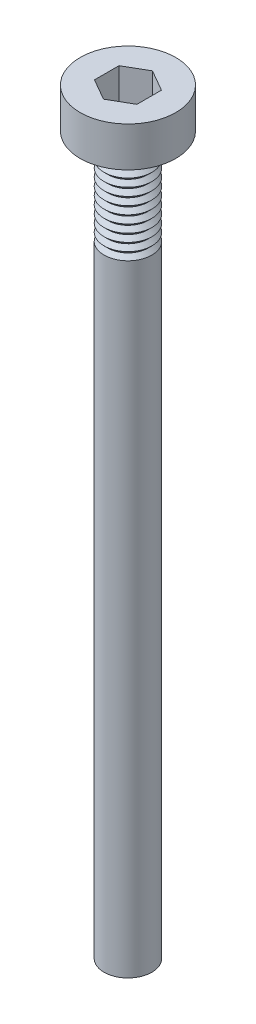
ISO-10303-21;
HEADER;
FILE_DESCRIPTION(('STEP AP214'),'2;1');
FILE_NAME('part.step','',(''),(''),'','','');
FILE_SCHEMA(('AUTOMOTIVE_DESIGN { 1 0 10303 214 1 1 1 1 }'));
ENDSEC;
DATA;
#1=APPLICATION_CONTEXT('core data for automotive mechanical design processes');
#2=APPLICATION_PROTOCOL_DEFINITION('international standard','automotive_design',2000,#1);
#3=PRODUCT_CONTEXT('',#1,'mechanical');
#4=PRODUCT('Part','Part','',(#3));
#5=PRODUCT_RELATED_PRODUCT_CATEGORY('part','',(#4));
#6=PRODUCT_DEFINITION_FORMATION('','',#4);
#7=PRODUCT_DEFINITION_CONTEXT('part definition',#1,'design');
#8=PRODUCT_DEFINITION('design','',#6,#7);
#9=PRODUCT_DEFINITION_SHAPE('','',#8);
#10=(LENGTH_UNIT() NAMED_UNIT(*) SI_UNIT(.MILLI.,.METRE.));
#11=(NAMED_UNIT(*) PLANE_ANGLE_UNIT() SI_UNIT($,.RADIAN.));
#12=(NAMED_UNIT(*) SI_UNIT($,.STERADIAN.) SOLID_ANGLE_UNIT());
#13=UNCERTAINTY_MEASURE_WITH_UNIT(LENGTH_MEASURE(1.E-05),#10,'distance_accuracy_value','');
#14=(GEOMETRIC_REPRESENTATION_CONTEXT(3) GLOBAL_UNCERTAINTY_ASSIGNED_CONTEXT((#13)) GLOBAL_UNIT_ASSIGNED_CONTEXT((#10,
#11,#12)) REPRESENTATION_CONTEXT('',''));
#15=CARTESIAN_POINT('',(0.,0.,0.));
#16=DIRECTION('',(0.,0.,1.));
#17=DIRECTION('',(1.,0.,0.));
#18=AXIS2_PLACEMENT_3D('',#15,#16,#17);
#19=CARTESIAN_POINT('',(-0.666144133604045,47.5,1.15379548456616));
#20=DIRECTION('',(-0.499999999999999,0.,0.866025403784439));
#21=DIRECTION('',(0.866025403784439,0.,0.499999999999999));
#22=AXIS2_PLACEMENT_3D('',#19,#20,#21);
#23=PLANE('',#22);
#24=DIRECTION('',(0.,1.,0.));
#25=VECTOR('',#24,1.);
#26=CARTESIAN_POINT('',(-1.33228826720809,47.5,0.769196989710771));
#27=LINE('',#26,#25);
#28=CARTESIAN_POINT('',(-1.33228826720809,45.5,0.769196989710773));
#29=VERTEX_POINT('',#28);
#30=CARTESIAN_POINT('',(-1.33228826720809,47.5,0.769196989710773));
#31=VERTEX_POINT('',#30);
#32=EDGE_CURVE('E81',#29,#31,#27,.T.);
#33=ORIENTED_EDGE('',*,*,#32,.T.);
#34=DIRECTION('',(0.866025403784439,0.,0.499999999999999));
#35=VECTOR('',#34,1.);
#36=CARTESIAN_POINT('',(-0.666144133604045,47.5,1.15379548456616));
#37=LINE('',#36,#35);
#38=CARTESIAN_POINT('',(0.,47.5,1.53839397942154));
#39=VERTEX_POINT('',#38);
#40=EDGE_CURVE('E71',#39,#31,#37,.F.);
#41=ORIENTED_EDGE('',*,*,#40,.F.);
#42=DIRECTION('',(0.,1.,0.));
#43=VECTOR('',#42,1.);
#44=CARTESIAN_POINT('',(0.,47.5,1.53839397942154));
#45=LINE('',#44,#43);
#46=CARTESIAN_POINT('',(0.,45.5,1.53839397942154));
#47=VERTEX_POINT('',#46);
#48=EDGE_CURVE('E132',#39,#47,#45,.F.);
#49=ORIENTED_EDGE('',*,*,#48,.T.);
#50=DIRECTION('',(0.866025403784439,0.,0.499999999999999));
#51=VECTOR('',#50,1.);
#52=CARTESIAN_POINT('',(-0.666144133604045,45.5,1.15379548456616));
#53=LINE('',#52,#51);
#54=EDGE_CURVE('E67',#29,#47,#53,.T.);
#55=ORIENTED_EDGE('',*,*,#54,.F.);
#56=EDGE_LOOP('',(#33,#41,#49,#55));
#57=FACE_BOUND('',#56,.T.);
#58=ADVANCED_FACE('F17',(#57),#23,.F.);
#59=CARTESIAN_POINT('',(-1.33228826720809,47.5,0.));
#60=DIRECTION('',(-1.,0.,0.));
#61=DIRECTION('',(0.,0.,1.));
#62=AXIS2_PLACEMENT_3D('',#59,#60,#61);
#63=PLANE('',#62);
#64=DIRECTION('',(0.,1.,0.));
#65=VECTOR('',#64,1.);
#66=CARTESIAN_POINT('',(-1.33228826720809,47.5,-0.769196989710775));
#67=LINE('',#66,#65);
#68=CARTESIAN_POINT('',(-1.33228826720809,45.5,-0.769196989710774));
#69=VERTEX_POINT('',#68);
#70=CARTESIAN_POINT('',(-1.33228826720809,47.5,-0.769196989710774));
#71=VERTEX_POINT('',#70);
#72=EDGE_CURVE('E86',#69,#71,#67,.T.);
#73=ORIENTED_EDGE('',*,*,#72,.T.);
#74=DIRECTION('',(0.,0.,1.));
#75=VECTOR('',#74,1.);
#76=CARTESIAN_POINT('',(-1.33228826720809,47.5,0.));
#77=LINE('',#76,#75);
#78=EDGE_CURVE('E74',#31,#71,#77,.F.);
#79=ORIENTED_EDGE('',*,*,#78,.F.);
#80=ORIENTED_EDGE('',*,*,#32,.F.);
#81=DIRECTION('',(0.,0.,1.));
#82=VECTOR('',#81,1.);
#83=CARTESIAN_POINT('',(-1.33228826720809,45.5,0.));
#84=LINE('',#83,#82);
#85=EDGE_CURVE('E87',#69,#29,#84,.T.);
#86=ORIENTED_EDGE('',*,*,#85,.F.);
#87=EDGE_LOOP('',(#73,#79,#80,#86));
#88=FACE_BOUND('',#87,.T.);
#89=ADVANCED_FACE('F84',(#88),#63,.F.);
#90=CARTESIAN_POINT('',(0.666144133604045,47.5,1.15379548456616));
#91=DIRECTION('',(0.499999999999998,0.,0.86602540378444));
#92=DIRECTION('',(0.86602540378444,0.,-0.499999999999998));
#93=AXIS2_PLACEMENT_3D('',#90,#91,#92);
#94=PLANE('',#93);
#95=ORIENTED_EDGE('',*,*,#48,.F.);
#96=DIRECTION('',(0.86602540378444,0.,-0.499999999999998));
#97=VECTOR('',#96,1.);
#98=CARTESIAN_POINT('',(0.666144133604045,47.5,1.15379548456616));
#99=LINE('',#98,#97);
#100=CARTESIAN_POINT('',(1.33228826720809,47.5,0.769196989710774));
#101=VERTEX_POINT('',#100);
#102=EDGE_CURVE('E77',#101,#39,#99,.F.);
#103=ORIENTED_EDGE('',*,*,#102,.F.);
#104=DIRECTION('',(0.,1.,0.));
#105=VECTOR('',#104,1.);
#106=CARTESIAN_POINT('',(1.33228826720809,47.5,0.769196989710773));
#107=LINE('',#106,#105);
#108=CARTESIAN_POINT('',(1.33228826720809,45.5,0.769196989710774));
#109=VERTEX_POINT('',#108);
#110=EDGE_CURVE('E123',#101,#109,#107,.F.);
#111=ORIENTED_EDGE('',*,*,#110,.T.);
#112=DIRECTION('',(0.86602540378444,0.,-0.499999999999998));
#113=VECTOR('',#112,1.);
#114=CARTESIAN_POINT('',(0.666144133604045,45.5,1.15379548456616));
#115=LINE('',#114,#113);
#116=EDGE_CURVE('E130',#47,#109,#115,.T.);
#117=ORIENTED_EDGE('',*,*,#116,.F.);
#118=EDGE_LOOP('',(#95,#103,#111,#117));
#119=FACE_BOUND('',#118,.T.);
#120=ADVANCED_FACE('F135',(#119),#94,.F.);
#121=CARTESIAN_POINT('',(-0.666144133604044,47.5,-1.15379548456616));
#122=DIRECTION('',(-0.499999999999998,0.,-0.86602540378444));
#123=DIRECTION('',(-0.86602540378444,0.,0.499999999999998));
#124=AXIS2_PLACEMENT_3D('',#121,#122,#123);
#125=PLANE('',#124);
#126=DIRECTION('',(0.,1.,0.));
#127=VECTOR('',#126,1.);
#128=CARTESIAN_POINT('',(0.,47.5,-1.53839397942154));
#129=LINE('',#128,#127);
#130=CARTESIAN_POINT('',(0.,45.5,-1.53839397942154));
#131=VERTEX_POINT('',#130);
#132=CARTESIAN_POINT('',(0.,47.5,-1.53839397942154));
#133=VERTEX_POINT('',#132);
#134=EDGE_CURVE('E115',#131,#133,#129,.T.);
#135=ORIENTED_EDGE('',*,*,#134,.T.);
#136=DIRECTION('',(-0.86602540378444,0.,0.499999999999998));
#137=VECTOR('',#136,1.);
#138=CARTESIAN_POINT('',(-0.666144133604044,47.5,-1.15379548456616));
#139=LINE('',#138,#137);
#140=EDGE_CURVE('E35',#71,#133,#139,.F.);
#141=ORIENTED_EDGE('',*,*,#140,.F.);
#142=ORIENTED_EDGE('',*,*,#72,.F.);
#143=DIRECTION('',(-0.86602540378444,0.,0.499999999999998));
#144=VECTOR('',#143,1.);
#145=CARTESIAN_POINT('',(0.,45.5,-1.53839397942154));
#146=LINE('',#145,#144);
#147=EDGE_CURVE('E117',#131,#69,#146,.T.);
#148=ORIENTED_EDGE('',*,*,#147,.F.);
#149=EDGE_LOOP('',(#135,#141,#142,#148));
#150=FACE_BOUND('',#149,.T.);
#151=ADVANCED_FACE('F142',(#150),#125,.F.);
#152=CARTESIAN_POINT('',(1.33228826720809,47.5,0.));
#153=DIRECTION('',(1.,0.,0.));
#154=DIRECTION('',(0.,0.,-1.));
#155=AXIS2_PLACEMENT_3D('',#152,#153,#154);
#156=PLANE('',#155);
#157=ORIENTED_EDGE('',*,*,#110,.F.);
#158=DIRECTION('',(0.,0.,-1.));
#159=VECTOR('',#158,1.);
#160=CARTESIAN_POINT('',(1.33228826720809,47.5,0.));
#161=LINE('',#160,#159);
#162=CARTESIAN_POINT('',(1.33228826720809,47.5,-0.769196989710772));
#163=VERTEX_POINT('',#162);
#164=EDGE_CURVE('E126',#163,#101,#161,.F.);
#165=ORIENTED_EDGE('',*,*,#164,.F.);
#166=DIRECTION('',(0.,1.,0.));
#167=VECTOR('',#166,1.);
#168=CARTESIAN_POINT('',(1.33228826720809,47.5,-0.769196989710775));
#169=LINE('',#168,#167);
#170=CARTESIAN_POINT('',(1.33228826720809,45.5,-0.769196989710772));
#171=VERTEX_POINT('',#170);
#172=EDGE_CURVE('E108',#163,#171,#169,.F.);
#173=ORIENTED_EDGE('',*,*,#172,.T.);
#174=DIRECTION('',(0.,0.,1.));
#175=VECTOR('',#174,1.);
#176=CARTESIAN_POINT('',(1.33228826720809,45.5,0.));
#177=LINE('',#176,#175);
#178=EDGE_CURVE('E120',#109,#171,#177,.F.);
#179=ORIENTED_EDGE('',*,*,#178,.F.);
#180=EDGE_LOOP('',(#157,#165,#173,#179));
#181=FACE_BOUND('',#180,.T.);
#182=ADVANCED_FACE('F148',(#181),#156,.F.);
#183=CARTESIAN_POINT('',(0.,45.5,0.));
#184=DIRECTION('',(0.,1.,0.));
#185=DIRECTION('',(0.,0.,1.));
#186=AXIS2_PLACEMENT_3D('',#183,#184,#185);
#187=PLANE('',#186);
#188=ORIENTED_EDGE('',*,*,#54,.T.);
#189=ORIENTED_EDGE('',*,*,#116,.T.);
#190=ORIENTED_EDGE('',*,*,#178,.T.);
#191=DIRECTION('',(-0.866025403784439,0.,-0.499999999999999));
#192=VECTOR('',#191,1.);
#193=CARTESIAN_POINT('',(0.666144133604046,45.5,-1.15379548456616));
#194=LINE('',#193,#192);
#195=EDGE_CURVE('E104',#171,#131,#194,.T.);
#196=ORIENTED_EDGE('',*,*,#195,.T.);
#197=ORIENTED_EDGE('',*,*,#147,.T.);
#198=ORIENTED_EDGE('',*,*,#85,.T.);
#199=EDGE_LOOP('',(#188,#189,#190,#196,#197,#198));
#200=FACE_BOUND('',#199,.T.);
#201=ADVANCED_FACE('F139',(#200),#187,.T.);
#202=CARTESIAN_POINT('',(0.666144133604046,47.5,-1.15379548456616));
#203=DIRECTION('',(0.499999999999999,0.,-0.866025403784439));
#204=DIRECTION('',(-0.866025403784439,0.,-0.499999999999999));
#205=AXIS2_PLACEMENT_3D('',#202,#203,#204);
#206=PLANE('',#205);
#207=ORIENTED_EDGE('',*,*,#172,.F.);
#208=DIRECTION('',(0.866025403784439,0.,0.499999999999999));
#209=VECTOR('',#208,1.);
#210=CARTESIAN_POINT('',(0.,47.5,-1.53839397942154));
#211=LINE('',#210,#209);
#212=EDGE_CURVE('E101',#133,#163,#211,.T.);
#213=ORIENTED_EDGE('',*,*,#212,.F.);
#214=ORIENTED_EDGE('',*,*,#134,.F.);
#215=ORIENTED_EDGE('',*,*,#195,.F.);
#216=EDGE_LOOP('',(#207,#213,#214,#215));
#217=FACE_BOUND('',#216,.T.);
#218=ADVANCED_FACE('F146',(#217),#206,.F.);
#219=CARTESIAN_POINT('',(1.5,47.5,0.));
#220=DIRECTION('',(0.,1.,0.));
#221=DIRECTION('',(0.,0.,1.));
#222=AXIS2_PLACEMENT_3D('',#219,#220,#221);
#223=PLANE('',#222);
#224=CARTESIAN_POINT('',(0.,47.5,0.));
#225=DIRECTION('',(0.,1.,0.));
#226=DIRECTION('',(0.,0.,1.));
#227=AXIS2_PLACEMENT_3D('',#224,#225,#226);
#228=CIRCLE('',#227,2.99999999999999);
#229=CARTESIAN_POINT('',(0.,47.5,2.99999999999999));
#230=VERTEX_POINT('',#229);
#231=EDGE_CURVE('E20',#230,#230,#228,.F.);
#232=ORIENTED_EDGE('',*,*,#231,.F.);
#233=EDGE_LOOP('',(#232));
#234=FACE_BOUND('',#233,.T.);
#235=ORIENTED_EDGE('',*,*,#140,.T.);
#236=ORIENTED_EDGE('',*,*,#212,.T.);
#237=ORIENTED_EDGE('',*,*,#164,.T.);
#238=ORIENTED_EDGE('',*,*,#102,.T.);
#239=ORIENTED_EDGE('',*,*,#40,.T.);
#240=ORIENTED_EDGE('',*,*,#78,.T.);
#241=EDGE_LOOP('',(#235,#236,#237,#238,#239,#240));
#242=FACE_BOUND('',#241,.T.);
#243=ADVANCED_FACE('F72',(#234,#242),#223,.T.);
#244=CARTESIAN_POINT('',(0.,46.25,0.));
#245=DIRECTION('',(0.,1.,0.));
#246=DIRECTION('',(0.,0.,1.));
#247=AXIS2_PLACEMENT_3D('',#244,#245,#246);
#248=CYLINDRICAL_SURFACE('',#247,2.99999999999999);
#249=CARTESIAN_POINT('',(0.,45.,0.));
#250=DIRECTION('',(0.,1.,0.));
#251=DIRECTION('',(0.,0.,1.));
#252=AXIS2_PLACEMENT_3D('',#249,#250,#251);
#253=CIRCLE('',#252,2.99999999999999);
#254=CARTESIAN_POINT('',(0.,45.,2.99999999999999));
#255=VERTEX_POINT('',#254);
#256=EDGE_CURVE('E96',#255,#255,#253,.F.);
#257=ORIENTED_EDGE('',*,*,#256,.F.);
#258=EDGE_LOOP('',(#257));
#259=FACE_BOUND('',#258,.T.);
#260=ORIENTED_EDGE('',*,*,#231,.T.);
#261=EDGE_LOOP('',(#260));
#262=FACE_BOUND('',#261,.T.);
#263=ADVANCED_FACE('F269',(#259,#262),#248,.T.);
#264=CARTESIAN_POINT('',(2.24999999999999,45.,0.));
#265=DIRECTION('',(0.,-1.,0.));
#266=DIRECTION('',(0.,0.,-1.));
#267=AXIS2_PLACEMENT_3D('',#264,#265,#266);
#268=PLANE('',#267);
#269=CARTESIAN_POINT('',(0.,45.0000000000159,0.));
#270=DIRECTION('',(0.,1.,0.));
#271=DIRECTION('',(0.,0.,1.));
#272=AXIS2_PLACEMENT_3D('',#269,#270,#271);
#273=CIRCLE('',#272,1.50000000002137);
#274=CARTESIAN_POINT('',(0.,45.0000000000159,1.50000000002137));
#275=VERTEX_POINT('',#274);
#276=EDGE_CURVE('E93',#275,#275,#273,.F.);
#277=ORIENTED_EDGE('',*,*,#276,.F.);
#278=EDGE_LOOP('',(#277));
#279=FACE_BOUND('',#278,.T.);
#280=ORIENTED_EDGE('',*,*,#256,.T.);
#281=EDGE_LOOP('',(#280));
#282=FACE_BOUND('',#281,.T.);
#283=ADVANCED_FACE('F265',(#279,#282),#268,.T.);
#284=CARTESIAN_POINT('',(0.,45.0000000000159,0.));
#285=DIRECTION('',(0.,1.,0.));
#286=DIRECTION('',(0.,0.,1.));
#287=AXIS2_PLACEMENT_3D('',#284,#285,#286);
#288=CONICAL_SURFACE('',#287,1.50000000002137,0.785398163397448);
#289=CARTESIAN_POINT('',(0.,44.7500000000218,0.));
#290=DIRECTION('',(0.,-1.,0.));
#291=DIRECTION('',(1.,0.,0.));
#292=AXIS2_PLACEMENT_3D('',#289,#290,#291);
#293=CIRCLE('',#292,1.25000000002728);
#294=CARTESIAN_POINT('',(1.25000000002728,44.7500000000218,0.));
#295=VERTEX_POINT('',#294);
#296=EDGE_CURVE('E95',#295,#295,#293,.T.);
#297=ORIENTED_EDGE('',*,*,#296,.F.);
#298=EDGE_LOOP('',(#297));
#299=FACE_BOUND('',#298,.T.);
#300=ORIENTED_EDGE('',*,*,#276,.T.);
#301=EDGE_LOOP('',(#300));
#302=FACE_BOUND('',#301,.T.);
#303=ADVANCED_FACE('F261',(#299,#302),#288,.T.);
#304=CARTESIAN_POINT('',(0.,44.5000000000277,0.));
#305=DIRECTION('',(0.,-1.,0.));
#306=DIRECTION('',(0.,0.,-1.));
#307=AXIS2_PLACEMENT_3D('',#304,#305,#306);
#308=CONICAL_SURFACE('',#307,1.50000000002137,0.785398163397448);
#309=CARTESIAN_POINT('',(0.,44.4999999999709,0.));
#310=DIRECTION('',(0.,1.,0.));
#311=DIRECTION('',(1.,0.,0.));
#312=AXIS2_PLACEMENT_3D('',#309,#310,#311);
#313=CIRCLE('',#312,1.49999999996453);
#314=CARTESIAN_POINT('',(1.49999999996453,44.4999999999709,0.));
#315=VERTEX_POINT('',#314);
#316=EDGE_CURVE('E506',#315,#315,#313,.F.);
#317=ORIENTED_EDGE('',*,*,#316,.F.);
#318=EDGE_LOOP('',(#317));
#319=FACE_BOUND('',#318,.T.);
#320=ORIENTED_EDGE('',*,*,#296,.T.);
#321=EDGE_LOOP('',(#320));
#322=FACE_BOUND('',#321,.T.);
#323=ADVANCED_FACE('F257',(#319,#322),#308,.T.);
#324=CARTESIAN_POINT('',(0.,44.4999999999709,0.));
#325=DIRECTION('',(0.,1.,0.));
#326=DIRECTION('',(0.,0.,1.));
#327=AXIS2_PLACEMENT_3D('',#324,#325,#326);
#328=CONICAL_SURFACE('',#327,1.49999999996453,0.785398163397448);
#329=CARTESIAN_POINT('',(0.,44.2500000000337,0.));
#330=DIRECTION('',(0.,-1.,0.));
#331=DIRECTION('',(1.,0.,0.));
#332=AXIS2_PLACEMENT_3D('',#329,#330,#331);
#333=CIRCLE('',#332,1.25000000002728);
#334=CARTESIAN_POINT('',(1.25000000002728,44.2500000000337,0.));
#335=VERTEX_POINT('',#334);
#336=EDGE_CURVE('E508',#335,#335,#333,.T.);
#337=ORIENTED_EDGE('',*,*,#336,.F.);
#338=EDGE_LOOP('',(#337));
#339=FACE_BOUND('',#338,.T.);
#340=ORIENTED_EDGE('',*,*,#316,.T.);
#341=EDGE_LOOP('',(#340));
#342=FACE_BOUND('',#341,.T.);
#343=ADVANCED_FACE('F253',(#339,#342),#328,.T.);
#344=CARTESIAN_POINT('',(0.,44.0000000000396,0.));
#345=DIRECTION('',(0.,-1.,0.));
#346=DIRECTION('',(0.,0.,-1.));
#347=AXIS2_PLACEMENT_3D('',#344,#345,#346);
#348=CONICAL_SURFACE('',#347,1.50000000002137,0.785398163397448);
#349=CARTESIAN_POINT('',(0.,44.0000000000396,0.));
#350=DIRECTION('',(0.,1.,0.));
#351=DIRECTION('',(1.,0.,0.));
#352=AXIS2_PLACEMENT_3D('',#349,#350,#351);
#353=CIRCLE('',#352,1.50000000002137);
#354=CARTESIAN_POINT('',(1.50000000002137,44.0000000000396,0.));
#355=VERTEX_POINT('',#354);
#356=EDGE_CURVE('E517',#355,#355,#353,.F.);
#357=ORIENTED_EDGE('',*,*,#356,.F.);
#358=EDGE_LOOP('',(#357));
#359=FACE_BOUND('',#358,.T.);
#360=ORIENTED_EDGE('',*,*,#336,.T.);
#361=EDGE_LOOP('',(#360));
#362=FACE_BOUND('',#361,.T.);
#363=ADVANCED_FACE('F249',(#359,#362),#348,.T.);
#364=CARTESIAN_POINT('',(0.,44.0000000000396,0.));
#365=DIRECTION('',(0.,1.,0.));
#366=DIRECTION('',(0.,0.,1.));
#367=AXIS2_PLACEMENT_3D('',#364,#365,#366);
#368=CONICAL_SURFACE('',#367,1.50000000002137,0.785398163397448);
#369=CARTESIAN_POINT('',(0.,43.7500000000455,0.));
#370=DIRECTION('',(0.,-1.,0.));
#371=DIRECTION('',(1.,0.,0.));
#372=AXIS2_PLACEMENT_3D('',#369,#370,#371);
#373=CIRCLE('',#372,1.24999999997044);
#374=CARTESIAN_POINT('',(1.24999999997044,43.7500000000455,0.));
#375=VERTEX_POINT('',#374);
#376=EDGE_CURVE('E522',#375,#375,#373,.T.);
#377=ORIENTED_EDGE('',*,*,#376,.F.);
#378=EDGE_LOOP('',(#377));
#379=FACE_BOUND('',#378,.T.);
#380=ORIENTED_EDGE('',*,*,#356,.T.);
#381=EDGE_LOOP('',(#380));
#382=FACE_BOUND('',#381,.T.);
#383=ADVANCED_FACE('F245',(#379,#382),#368,.T.);
#384=CARTESIAN_POINT('',(0.,43.4999999999377,0.));
#385=DIRECTION('',(0.,-1.,0.));
#386=DIRECTION('',(0.,0.,-1.));
#387=AXIS2_PLACEMENT_3D('',#384,#385,#386);
#388=CONICAL_SURFACE('',#387,1.50000000002137,0.785398163283761);
#389=CARTESIAN_POINT('',(0.,43.4999999999945,0.));
#390=DIRECTION('',(0.,1.,0.));
#391=DIRECTION('',(1.,0.,0.));
#392=AXIS2_PLACEMENT_3D('',#389,#390,#391);
#393=CIRCLE('',#392,1.49999999996453);
#394=CARTESIAN_POINT('',(1.49999999996453,43.4999999999945,0.));
#395=VERTEX_POINT('',#394);
#396=EDGE_CURVE('E527',#395,#395,#393,.F.);
#397=ORIENTED_EDGE('',*,*,#396,.F.);
#398=EDGE_LOOP('',(#397));
#399=FACE_BOUND('',#398,.T.);
#400=ORIENTED_EDGE('',*,*,#376,.T.);
#401=EDGE_LOOP('',(#400));
#402=FACE_BOUND('',#401,.T.);
#403=ADVANCED_FACE('F241',(#399,#402),#388,.T.);
#404=CARTESIAN_POINT('',(0.,43.4999999999945,0.));
#405=DIRECTION('',(0.,1.,0.));
#406=DIRECTION('',(0.,0.,1.));
#407=AXIS2_PLACEMENT_3D('',#404,#405,#406);
#408=CONICAL_SURFACE('',#407,1.49999999996453,0.785398163397448);
#409=CARTESIAN_POINT('',(0.,43.2500000000005,0.));
#410=DIRECTION('',(0.,-1.,0.));
#411=DIRECTION('',(1.,0.,0.));
#412=AXIS2_PLACEMENT_3D('',#409,#410,#411);
#413=CIRCLE('',#412,1.24999999997044);
#414=CARTESIAN_POINT('',(1.24999999997044,43.2500000000005,0.));
#415=VERTEX_POINT('',#414);
#416=EDGE_CURVE('E532',#415,#415,#413,.T.);
#417=ORIENTED_EDGE('',*,*,#416,.F.);
#418=EDGE_LOOP('',(#417));
#419=FACE_BOUND('',#418,.T.);
#420=ORIENTED_EDGE('',*,*,#396,.T.);
#421=EDGE_LOOP('',(#420));
#422=FACE_BOUND('',#421,.T.);
#423=ADVANCED_FACE('F237',(#419,#422),#408,.T.);
#424=CARTESIAN_POINT('',(0.,42.9999999998927,0.));
#425=DIRECTION('',(0.,-1.,0.));
#426=DIRECTION('',(0.,0.,-1.));
#427=AXIS2_PLACEMENT_3D('',#424,#425,#426);
#428=CONICAL_SURFACE('',#427,1.50000000002137,0.785398163283761);
#429=CARTESIAN_POINT('',(0.,43.0000000000064,0.));
#430=DIRECTION('',(0.,1.,0.));
#431=DIRECTION('',(1.,0.,0.));
#432=AXIS2_PLACEMENT_3D('',#429,#430,#431);
#433=CIRCLE('',#432,1.50000000002137);
#434=CARTESIAN_POINT('',(1.50000000002137,43.0000000000064,0.));
#435=VERTEX_POINT('',#434);
#436=EDGE_CURVE('E537',#435,#435,#433,.F.);
#437=ORIENTED_EDGE('',*,*,#436,.F.);
#438=EDGE_LOOP('',(#437));
#439=FACE_BOUND('',#438,.T.);
#440=ORIENTED_EDGE('',*,*,#416,.T.);
#441=EDGE_LOOP('',(#440));
#442=FACE_BOUND('',#441,.T.);
#443=ADVANCED_FACE('F233',(#439,#442),#428,.T.);
#444=CARTESIAN_POINT('',(0.,43.0000000000064,0.));
#445=DIRECTION('',(0.,1.,0.));
#446=DIRECTION('',(0.,0.,1.));
#447=AXIS2_PLACEMENT_3D('',#444,#445,#446);
#448=CONICAL_SURFACE('',#447,1.50000000002137,0.785398163283761);
#449=CARTESIAN_POINT('',(0.,42.7500000000123,0.));
#450=DIRECTION('',(0.,-1.,0.));
#451=DIRECTION('',(1.,0.,0.));
#452=AXIS2_PLACEMENT_3D('',#449,#450,#451);
#453=CIRCLE('',#452,1.24999999997044);
#454=CARTESIAN_POINT('',(1.24999999997044,42.7500000000123,0.));
#455=VERTEX_POINT('',#454);
#456=EDGE_CURVE('E542',#455,#455,#453,.T.);
#457=ORIENTED_EDGE('',*,*,#456,.F.);
#458=EDGE_LOOP('',(#457));
#459=FACE_BOUND('',#458,.T.);
#460=ORIENTED_EDGE('',*,*,#436,.T.);
#461=EDGE_LOOP('',(#460));
#462=FACE_BOUND('',#461,.T.);
#463=ADVANCED_FACE('F229',(#459,#462),#448,.T.);
#464=CARTESIAN_POINT('',(0.,42.4999999999045,0.));
#465=DIRECTION('',(0.,-1.,0.));
#466=DIRECTION('',(0.,0.,-1.));
#467=AXIS2_PLACEMENT_3D('',#464,#465,#466);
#468=CONICAL_SURFACE('',#467,1.50000000002137,0.785398163283761);
#469=CARTESIAN_POINT('',(0.,42.5000000000182,0.));
#470=DIRECTION('',(0.,1.,0.));
#471=DIRECTION('',(1.,0.,0.));
#472=AXIS2_PLACEMENT_3D('',#469,#470,#471);
#473=CIRCLE('',#472,1.49999999996453);
#474=CARTESIAN_POINT('',(1.49999999996453,42.5000000000182,0.));
#475=VERTEX_POINT('',#474);
#476=EDGE_CURVE('E547',#475,#475,#473,.F.);
#477=ORIENTED_EDGE('',*,*,#476,.F.);
#478=EDGE_LOOP('',(#477));
#479=FACE_BOUND('',#478,.T.);
#480=ORIENTED_EDGE('',*,*,#456,.T.);
#481=EDGE_LOOP('',(#480));
#482=FACE_BOUND('',#481,.T.);
#483=ADVANCED_FACE('F225',(#479,#482),#468,.T.);
#484=CARTESIAN_POINT('',(0.,42.500000000075,0.));
#485=DIRECTION('',(0.,1.,0.));
#486=DIRECTION('',(0.,0.,1.));
#487=AXIS2_PLACEMENT_3D('',#484,#485,#486);
#488=CONICAL_SURFACE('',#487,1.50000000002137,0.785398163283761);
#489=CARTESIAN_POINT('',(0.,42.2500000000241,0.));
#490=DIRECTION('',(0.,-1.,0.));
#491=DIRECTION('',(1.,0.,0.));
#492=AXIS2_PLACEMENT_3D('',#489,#490,#491);
#493=CIRCLE('',#492,1.25000000002728);
#494=CARTESIAN_POINT('',(1.25000000002728,42.2500000000241,0.));
#495=VERTEX_POINT('',#494);
#496=EDGE_CURVE('E552',#495,#495,#493,.T.);
#497=ORIENTED_EDGE('',*,*,#496,.F.);
#498=EDGE_LOOP('',(#497));
#499=FACE_BOUND('',#498,.T.);
#500=ORIENTED_EDGE('',*,*,#476,.T.);
#501=EDGE_LOOP('',(#500));
#502=FACE_BOUND('',#501,.T.);
#503=ADVANCED_FACE('F221',(#499,#502),#488,.T.);
#504=CARTESIAN_POINT('',(0.,42.00000000003,0.));
#505=DIRECTION('',(0.,-1.,0.));
#506=DIRECTION('',(0.,0.,-1.));
#507=AXIS2_PLACEMENT_3D('',#504,#505,#506);
#508=CONICAL_SURFACE('',#507,1.50000000002137,0.785398163397448);
#509=CARTESIAN_POINT('',(0.,42.00000000003,0.));
#510=DIRECTION('',(0.,1.,0.));
#511=DIRECTION('',(1.,0.,0.));
#512=AXIS2_PLACEMENT_3D('',#509,#510,#511);
#513=CIRCLE('',#512,1.50000000002137);
#514=CARTESIAN_POINT('',(1.50000000002137,42.00000000003,0.));
#515=VERTEX_POINT('',#514);
#516=EDGE_CURVE('E557',#515,#515,#513,.F.);
#517=ORIENTED_EDGE('',*,*,#516,.F.);
#518=EDGE_LOOP('',(#517));
#519=FACE_BOUND('',#518,.T.);
#520=ORIENTED_EDGE('',*,*,#496,.T.);
#521=EDGE_LOOP('',(#520));
#522=FACE_BOUND('',#521,.T.);
#523=ADVANCED_FACE('F217',(#519,#522),#508,.T.);
#524=CARTESIAN_POINT('',(0.,42.00000000003,0.));
#525=DIRECTION('',(0.,1.,0.));
#526=DIRECTION('',(0.,0.,1.));
#527=AXIS2_PLACEMENT_3D('',#524,#525,#526);
#528=CONICAL_SURFACE('',#527,1.50000000002137,0.785398163397448);
#529=CARTESIAN_POINT('',(0.,41.7500000000359,0.));
#530=DIRECTION('',(0.,-1.,0.));
#531=DIRECTION('',(1.,0.,0.));
#532=AXIS2_PLACEMENT_3D('',#529,#530,#531);
#533=CIRCLE('',#532,1.25000000002728);
#534=CARTESIAN_POINT('',(1.25000000002728,41.7500000000359,0.));
#535=VERTEX_POINT('',#534);
#536=EDGE_CURVE('E562',#535,#535,#533,.T.);
#537=ORIENTED_EDGE('',*,*,#536,.F.);
#538=EDGE_LOOP('',(#537));
#539=FACE_BOUND('',#538,.T.);
#540=ORIENTED_EDGE('',*,*,#516,.T.);
#541=EDGE_LOOP('',(#540));
#542=FACE_BOUND('',#541,.T.);
#543=ADVANCED_FACE('F213',(#539,#542),#528,.T.);
#544=CARTESIAN_POINT('',(0.,41.5000000000418,0.));
#545=DIRECTION('',(0.,-1.,0.));
#546=DIRECTION('',(0.,0.,-1.));
#547=AXIS2_PLACEMENT_3D('',#544,#545,#546);
#548=CONICAL_SURFACE('',#547,1.50000000002137,0.785398163397448);
#549=CARTESIAN_POINT('',(0.,41.5000000000418,0.));
#550=DIRECTION('',(0.,1.,0.));
#551=DIRECTION('',(1.,0.,0.));
#552=AXIS2_PLACEMENT_3D('',#549,#550,#551);
#553=CIRCLE('',#552,1.49999999996453);
#554=CARTESIAN_POINT('',(1.49999999996453,41.5000000000418,0.));
#555=VERTEX_POINT('',#554);
#556=EDGE_CURVE('E567',#555,#555,#553,.F.);
#557=ORIENTED_EDGE('',*,*,#556,.F.);
#558=EDGE_LOOP('',(#557));
#559=FACE_BOUND('',#558,.T.);
#560=ORIENTED_EDGE('',*,*,#536,.T.);
#561=EDGE_LOOP('',(#560));
#562=FACE_BOUND('',#561,.T.);
#563=ADVANCED_FACE('F209',(#559,#562),#548,.T.);
#564=CARTESIAN_POINT('',(0.,41.5000000000418,0.));
#565=DIRECTION('',(0.,1.,0.));
#566=DIRECTION('',(0.,0.,1.));
#567=AXIS2_PLACEMENT_3D('',#564,#565,#566);
#568=CONICAL_SURFACE('',#567,1.49999999996453,0.785398163397448);
#569=CARTESIAN_POINT('',(0.,41.2500000000477,0.));
#570=DIRECTION('',(0.,-1.,0.));
#571=DIRECTION('',(1.,0.,0.));
#572=AXIS2_PLACEMENT_3D('',#569,#570,#571);
#573=CIRCLE('',#572,1.24999999997044);
#574=CARTESIAN_POINT('',(1.24999999997044,41.2500000000477,0.));
#575=VERTEX_POINT('',#574);
#576=EDGE_CURVE('E572',#575,#575,#573,.T.);
#577=ORIENTED_EDGE('',*,*,#576,.F.);
#578=EDGE_LOOP('',(#577));
#579=FACE_BOUND('',#578,.T.);
#580=ORIENTED_EDGE('',*,*,#556,.T.);
#581=EDGE_LOOP('',(#580));
#582=FACE_BOUND('',#581,.T.);
#583=ADVANCED_FACE('F205',(#579,#582),#568,.T.);
#584=CARTESIAN_POINT('',(0.,40.99999999994,0.));
#585=DIRECTION('',(0.,-1.,0.));
#586=DIRECTION('',(0.,0.,-1.));
#587=AXIS2_PLACEMENT_3D('',#584,#585,#586);
#588=CONICAL_SURFACE('',#587,1.50000000002137,0.785398163283761);
#589=CARTESIAN_POINT('',(0.,40.9999999999968,0.));
#590=DIRECTION('',(0.,1.,0.));
#591=DIRECTION('',(1.,0.,0.));
#592=AXIS2_PLACEMENT_3D('',#589,#590,#591);
#593=CIRCLE('',#592,1.50000000002137);
#594=CARTESIAN_POINT('',(1.50000000002137,40.9999999999968,0.));
#595=VERTEX_POINT('',#594);
#596=EDGE_CURVE('E577',#595,#595,#593,.F.);
#597=ORIENTED_EDGE('',*,*,#596,.F.);
#598=EDGE_LOOP('',(#597));
#599=FACE_BOUND('',#598,.T.);
#600=ORIENTED_EDGE('',*,*,#576,.T.);
#601=EDGE_LOOP('',(#600));
#602=FACE_BOUND('',#601,.T.);
#603=ADVANCED_FACE('F201',(#599,#602),#588,.T.);
#604=CARTESIAN_POINT('',(0.,41.0000000000537,0.));
#605=DIRECTION('',(0.,1.,0.));
#606=DIRECTION('',(0.,0.,1.));
#607=AXIS2_PLACEMENT_3D('',#604,#605,#606);
#608=CONICAL_SURFACE('',#607,1.50000000013506,0.785398163397448);
#609=CARTESIAN_POINT('',(0.,40.7500000000027,0.));
#610=DIRECTION('',(0.,-1.,0.));
#611=DIRECTION('',(1.,0.,0.));
#612=AXIS2_PLACEMENT_3D('',#609,#610,#611);
#613=CIRCLE('',#612,1.24999999997044);
#614=CARTESIAN_POINT('',(1.24999999997044,40.7500000000027,0.));
#615=VERTEX_POINT('',#614);
#616=EDGE_CURVE('E582',#615,#615,#613,.T.);
#617=ORIENTED_EDGE('',*,*,#616,.F.);
#618=EDGE_LOOP('',(#617));
#619=FACE_BOUND('',#618,.T.);
#620=ORIENTED_EDGE('',*,*,#596,.T.);
#621=EDGE_LOOP('',(#620));
#622=FACE_BOUND('',#621,.T.);
#623=ADVANCED_FACE('F197',(#619,#622),#608,.T.);
#624=CARTESIAN_POINT('',(0.,40.499999999895,0.));
#625=DIRECTION('',(0.,-1.,0.));
#626=DIRECTION('',(0.,0.,-1.));
#627=AXIS2_PLACEMENT_3D('',#624,#625,#626);
#628=CONICAL_SURFACE('',#627,1.50000000002137,0.785398163283761);
#629=CARTESIAN_POINT('',(0.,40.4999999999518,0.));
#630=DIRECTION('',(0.,1.,0.));
#631=DIRECTION('',(1.,0.,0.));
#632=AXIS2_PLACEMENT_3D('',#629,#630,#631);
#633=CIRCLE('',#632,1.50000000002137);
#634=CARTESIAN_POINT('',(1.50000000002137,40.4999999999518,0.));
#635=VERTEX_POINT('',#634);
#636=EDGE_CURVE('E587',#635,#635,#633,.F.);
#637=ORIENTED_EDGE('',*,*,#636,.F.);
#638=EDGE_LOOP('',(#637));
#639=FACE_BOUND('',#638,.T.);
#640=ORIENTED_EDGE('',*,*,#616,.T.);
#641=EDGE_LOOP('',(#640));
#642=FACE_BOUND('',#641,.T.);
#643=ADVANCED_FACE('F193',(#639,#642),#628,.T.);
#644=CARTESIAN_POINT('',(0.,40.4999999999518,0.));
#645=DIRECTION('',(0.,1.,0.));
#646=DIRECTION('',(0.,0.,1.));
#647=AXIS2_PLACEMENT_3D('',#644,#645,#646);
#648=CONICAL_SURFACE('',#647,1.50000000002137,0.785398163397448);
#649=CARTESIAN_POINT('',(0.,40.2500000000146,0.));
#650=DIRECTION('',(0.,-1.,0.));
#651=DIRECTION('',(1.,0.,0.));
#652=AXIS2_PLACEMENT_3D('',#649,#650,#651);
#653=CIRCLE('',#652,1.24999999997044);
#654=CARTESIAN_POINT('',(1.24999999997044,40.2500000000146,0.));
#655=VERTEX_POINT('',#654);
#656=EDGE_CURVE('E592',#655,#655,#653,.T.);
#657=ORIENTED_EDGE('',*,*,#656,.F.);
#658=EDGE_LOOP('',(#657));
#659=FACE_BOUND('',#658,.T.);
#660=ORIENTED_EDGE('',*,*,#636,.T.);
#661=EDGE_LOOP('',(#660));
#662=FACE_BOUND('',#661,.T.);
#663=ADVANCED_FACE('F189',(#659,#662),#648,.T.);
#664=CARTESIAN_POINT('',(0.,39.9999999999068,0.));
#665=DIRECTION('',(0.,-1.,0.));
#666=DIRECTION('',(0.,0.,-1.));
#667=AXIS2_PLACEMENT_3D('',#664,#665,#666);
#668=CONICAL_SURFACE('',#667,1.50000000002137,0.785398163283761);
#669=CARTESIAN_POINT('',(0.,40.0000000000205,0.));
#670=DIRECTION('',(0.,1.,0.));
#671=DIRECTION('',(1.,0.,0.));
#672=AXIS2_PLACEMENT_3D('',#669,#670,#671);
#673=CIRCLE('',#672,1.50000000002137);
#674=CARTESIAN_POINT('',(1.50000000002137,40.0000000000205,0.));
#675=VERTEX_POINT('',#674);
#676=EDGE_CURVE('E597',#675,#675,#673,.F.);
#677=ORIENTED_EDGE('',*,*,#676,.F.);
#678=EDGE_LOOP('',(#677));
#679=FACE_BOUND('',#678,.T.);
#680=ORIENTED_EDGE('',*,*,#656,.T.);
#681=EDGE_LOOP('',(#680));
#682=FACE_BOUND('',#681,.T.);
#683=ADVANCED_FACE('F185',(#679,#682),#668,.T.);
#684=CARTESIAN_POINT('',(0.,40.0000000000205,0.));
#685=DIRECTION('',(0.,1.,0.));
#686=DIRECTION('',(0.,0.,1.));
#687=AXIS2_PLACEMENT_3D('',#684,#685,#686);
#688=CONICAL_SURFACE('',#687,1.50000000002137,0.785398163397448);
#689=CARTESIAN_POINT('',(0.,39.7500000000264,0.));
#690=DIRECTION('',(0.,-1.,0.));
#691=DIRECTION('',(1.,0.,0.));
#692=AXIS2_PLACEMENT_3D('',#689,#690,#691);
#693=CIRCLE('',#692,1.24999999997044);
#694=CARTESIAN_POINT('',(1.24999999997044,39.7500000000264,0.));
#695=VERTEX_POINT('',#694);
#696=EDGE_CURVE('E602',#695,#695,#693,.T.);
#697=ORIENTED_EDGE('',*,*,#696,.F.);
#698=EDGE_LOOP('',(#697));
#699=FACE_BOUND('',#698,.T.);
#700=ORIENTED_EDGE('',*,*,#676,.T.);
#701=EDGE_LOOP('',(#700));
#702=FACE_BOUND('',#701,.T.);
#703=ADVANCED_FACE('F181',(#699,#702),#688,.T.);
#704=CARTESIAN_POINT('',(0.,39.5000000000323,0.));
#705=DIRECTION('',(0.,-1.,0.));
#706=DIRECTION('',(0.,0.,-1.));
#707=AXIS2_PLACEMENT_3D('',#704,#705,#706);
#708=CONICAL_SURFACE('',#707,1.49999999996453,0.785398163397448);
#709=CARTESIAN_POINT('',(0.,39.5000000000323,0.));
#710=DIRECTION('',(0.,1.,0.));
#711=DIRECTION('',(1.,0.,0.));
#712=AXIS2_PLACEMENT_3D('',#709,#710,#711);
#713=CIRCLE('',#712,1.49999999996453);
#714=CARTESIAN_POINT('',(1.49999999996453,39.5000000000323,0.));
#715=VERTEX_POINT('',#714);
#716=EDGE_CURVE('E607',#715,#715,#713,.F.);
#717=ORIENTED_EDGE('',*,*,#716,.F.);
#718=EDGE_LOOP('',(#717));
#719=FACE_BOUND('',#718,.T.);
#720=ORIENTED_EDGE('',*,*,#696,.T.);
#721=EDGE_LOOP('',(#720));
#722=FACE_BOUND('',#721,.T.);
#723=ADVANCED_FACE('F177',(#719,#722),#708,.T.);
#724=CARTESIAN_POINT('',(0.,39.5000000000323,0.));
#725=DIRECTION('',(0.,1.,0.));
#726=DIRECTION('',(0.,0.,1.));
#727=AXIS2_PLACEMENT_3D('',#724,#725,#726);
#728=CONICAL_SURFACE('',#727,1.49999999996453,0.785398163397448);
#729=CARTESIAN_POINT('',(0.,39.2499999999814,0.));
#730=DIRECTION('',(0.,-1.,0.));
#731=DIRECTION('',(1.,0.,0.));
#732=AXIS2_PLACEMENT_3D('',#729,#730,#731);
#733=CIRCLE('',#732,1.25000000002728);
#734=CARTESIAN_POINT('',(1.25000000002728,39.2499999999814,0.));
#735=VERTEX_POINT('',#734);
#736=EDGE_CURVE('E612',#735,#735,#733,.T.);
#737=ORIENTED_EDGE('',*,*,#736,.F.);
#738=EDGE_LOOP('',(#737));
#739=FACE_BOUND('',#738,.T.);
#740=ORIENTED_EDGE('',*,*,#716,.T.);
#741=EDGE_LOOP('',(#740));
#742=FACE_BOUND('',#741,.T.);
#743=ADVANCED_FACE('F173',(#739,#742),#728,.T.);
#744=CARTESIAN_POINT('',(0.,39.0000000000441,0.));
#745=DIRECTION('',(0.,-1.,0.));
#746=DIRECTION('',(0.,0.,-1.));
#747=AXIS2_PLACEMENT_3D('',#744,#745,#746);
#748=CONICAL_SURFACE('',#747,1.49999999996453,0.785398163283761);
#749=CARTESIAN_POINT('',(0.,39.,0.));
#750=DIRECTION('',(0.,1.,0.));
#751=DIRECTION('',(0.,0.,1.));
#752=AXIS2_PLACEMENT_3D('',#749,#750,#751);
#753=CIRCLE('',#752,1.49999999999991);
#754=CARTESIAN_POINT('',(0.,39.,1.49999999999991));
#755=VERTEX_POINT('',#754);
#756=EDGE_CURVE('E26',#755,#755,#753,.F.);
#757=ORIENTED_EDGE('',*,*,#756,.F.);
#758=EDGE_LOOP('',(#757));
#759=FACE_BOUND('',#758,.T.);
#760=ORIENTED_EDGE('',*,*,#736,.T.);
#761=EDGE_LOOP('',(#760));
#762=FACE_BOUND('',#761,.T.);
#763=ADVANCED_FACE('F166',(#759,#762),#748,.T.);
#764=CARTESIAN_POINT('',(0.749999999999911,0.,0.));
#765=DIRECTION('',(0.,-1.,0.));
#766=DIRECTION('',(0.,0.,-1.));
#767=AXIS2_PLACEMENT_3D('',#764,#765,#766);
#768=PLANE('',#767);
#769=CARTESIAN_POINT('',(0.,0.,0.));
#770=DIRECTION('',(0.,1.,0.));
#771=DIRECTION('',(0.,0.,1.));
#772=AXIS2_PLACEMENT_3D('',#769,#770,#771);
#773=CIRCLE('',#772,1.49999999999991);
#774=CARTESIAN_POINT('',(0.,0.,1.49999999999991));
#775=VERTEX_POINT('',#774);
#776=EDGE_CURVE('E11',#775,#775,#773,.T.);
#777=ORIENTED_EDGE('',*,*,#776,.F.);
#778=EDGE_LOOP('',(#777));
#779=FACE_BOUND('',#778,.T.);
#780=ADVANCED_FACE('F160',(#779),#768,.T.);
#781=CARTESIAN_POINT('',(0.,19.5,0.));
#782=DIRECTION('',(0.,1.,0.));
#783=DIRECTION('',(0.,0.,1.));
#784=AXIS2_PLACEMENT_3D('',#781,#782,#783);
#785=CYLINDRICAL_SURFACE('',#784,1.49999999999991);
#786=ORIENTED_EDGE('',*,*,#776,.T.);
#787=EDGE_LOOP('',(#786));
#788=FACE_BOUND('',#787,.T.);
#789=ORIENTED_EDGE('',*,*,#756,.T.);
#790=EDGE_LOOP('',(#789));
#791=FACE_BOUND('',#790,.T.);
#792=ADVANCED_FACE('F158',(#788,#791),#785,.T.);
#793=CLOSED_SHELL('',(#58,#89,#120,#151,#182,#201,#218,#243,#263,#283,#303,#323,#343,#363,#383,
#403,#423,#443,#463,#483,#503,#523,#543,#563,#583,#603,#623,#643,#663,#683,#703,#723,#743,#763,
#780,#792));
#794=MANIFOLD_SOLID_BREP('B1',#793);
#795=ADVANCED_BREP_SHAPE_REPRESENTATION('',(#18,#794),#14);
#796=SHAPE_DEFINITION_REPRESENTATION(#9,#795);
ENDSEC;
END-ISO-10303-21;
